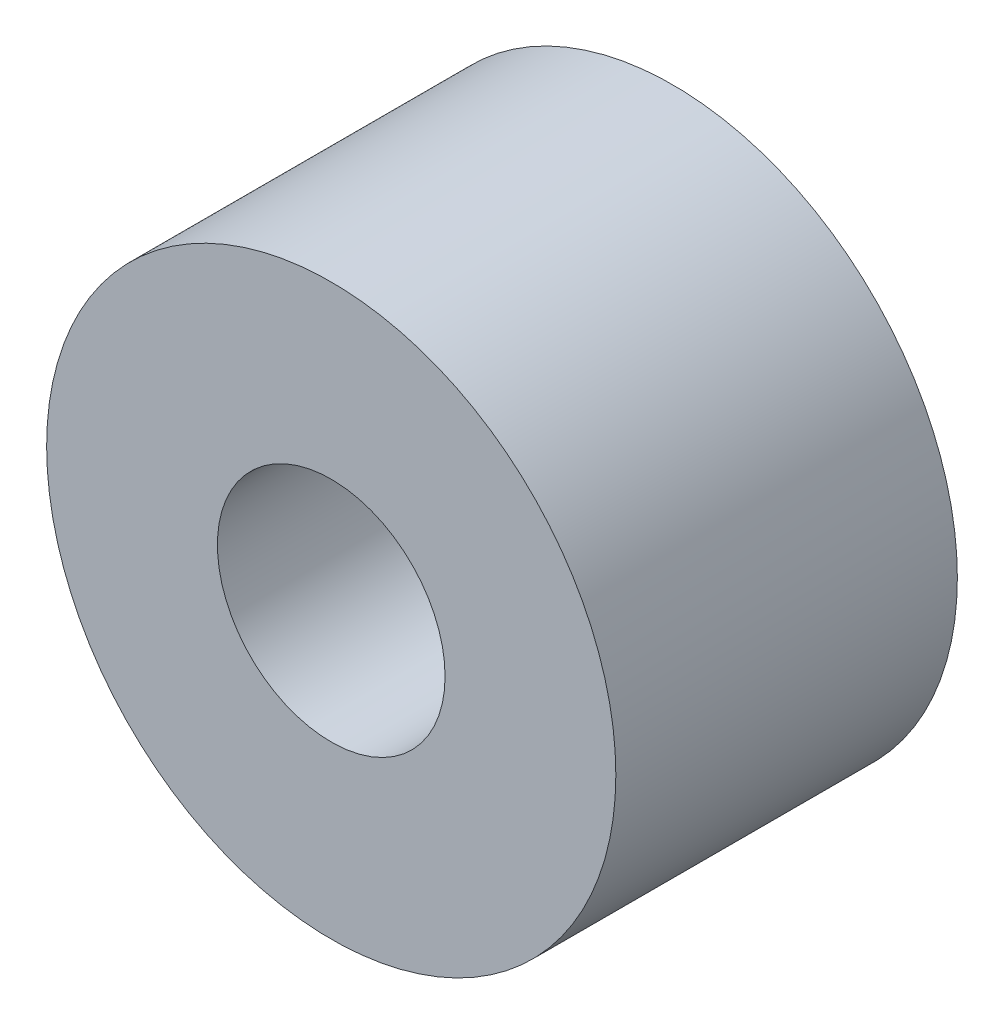
ISO-10303-21;
HEADER;
FILE_DESCRIPTION(('STEP AP214'),'2;1');
FILE_NAME('part.step','',(''),(''),'','','');
FILE_SCHEMA(('AUTOMOTIVE_DESIGN { 1 0 10303 214 1 1 1 1 }'));
ENDSEC;
DATA;
#1=APPLICATION_CONTEXT('core data for automotive mechanical design processes');
#2=APPLICATION_PROTOCOL_DEFINITION('international standard','automotive_design',2000,#1);
#3=PRODUCT_CONTEXT('',#1,'mechanical');
#4=PRODUCT('Part','Part','',(#3));
#5=PRODUCT_RELATED_PRODUCT_CATEGORY('part','',(#4));
#6=PRODUCT_DEFINITION_FORMATION('','',#4);
#7=PRODUCT_DEFINITION_CONTEXT('part definition',#1,'design');
#8=PRODUCT_DEFINITION('design','',#6,#7);
#9=PRODUCT_DEFINITION_SHAPE('','',#8);
#10=(LENGTH_UNIT() NAMED_UNIT(*) SI_UNIT(.MILLI.,.METRE.));
#11=(NAMED_UNIT(*) PLANE_ANGLE_UNIT() SI_UNIT($,.RADIAN.));
#12=(NAMED_UNIT(*) SI_UNIT($,.STERADIAN.) SOLID_ANGLE_UNIT());
#13=UNCERTAINTY_MEASURE_WITH_UNIT(LENGTH_MEASURE(1.E-05),#10,'distance_accuracy_value','');
#14=(GEOMETRIC_REPRESENTATION_CONTEXT(3) GLOBAL_UNCERTAINTY_ASSIGNED_CONTEXT((#13)) GLOBAL_UNIT_ASSIGNED_CONTEXT((#10,
#11,#12)) REPRESENTATION_CONTEXT('',''));
#15=CARTESIAN_POINT('',(0.,0.,0.));
#16=DIRECTION('',(0.,0.,1.));
#17=DIRECTION('',(1.,0.,0.));
#18=AXIS2_PLACEMENT_3D('',#15,#16,#17);
#19=CARTESIAN_POINT('',(0.,0.,6.));
#20=DIRECTION('',(0.,0.,-1.));
#21=DIRECTION('',(-1.,0.,0.));
#22=AXIS2_PLACEMENT_3D('',#19,#20,#21);
#23=CYLINDRICAL_SURFACE('',#22,5.);
#24=CARTESIAN_POINT('',(0.,0.,6.));
#25=DIRECTION('',(0.,0.,1.));
#26=DIRECTION('',(1.,0.,0.));
#27=AXIS2_PLACEMENT_3D('',#24,#25,#26);
#28=CIRCLE('',#27,5.);
#29=CARTESIAN_POINT('',(5.,0.,6.));
#30=VERTEX_POINT('',#29);
#31=EDGE_CURVE('E10',#30,#30,#28,.T.);
#32=ORIENTED_EDGE('',*,*,#31,.F.);
#33=EDGE_LOOP('',(#32));
#34=FACE_BOUND('',#33,.T.);
#35=CARTESIAN_POINT('',(0.,0.,0.));
#36=DIRECTION('',(0.,0.,1.));
#37=DIRECTION('',(1.,0.,0.));
#38=AXIS2_PLACEMENT_3D('',#35,#36,#37);
#39=CIRCLE('',#38,5.);
#40=CARTESIAN_POINT('',(5.,0.,0.));
#41=VERTEX_POINT('',#40);
#42=EDGE_CURVE('E34',#41,#41,#39,.T.);
#43=ORIENTED_EDGE('',*,*,#42,.T.);
#44=EDGE_LOOP('',(#43));
#45=FACE_BOUND('',#44,.T.);
#46=ADVANCED_FACE('F31',(#34,#45),#23,.T.);
#47=CARTESIAN_POINT('',(0.,0.,6.));
#48=DIRECTION('',(0.,0.,1.));
#49=DIRECTION('',(1.,0.,0.));
#50=AXIS2_PLACEMENT_3D('',#47,#48,#49);
#51=PLANE('',#50);
#52=CARTESIAN_POINT('',(0.,0.,6.));
#53=DIRECTION('',(0.,0.,1.));
#54=DIRECTION('',(1.,0.,0.));
#55=AXIS2_PLACEMENT_3D('',#52,#53,#54);
#56=CIRCLE('',#55,2.);
#57=CARTESIAN_POINT('',(2.,0.,6.));
#58=VERTEX_POINT('',#57);
#59=EDGE_CURVE('E43',#58,#58,#56,.T.);
#60=ORIENTED_EDGE('',*,*,#59,.F.);
#61=EDGE_LOOP('',(#60));
#62=FACE_BOUND('',#61,.T.);
#63=ORIENTED_EDGE('',*,*,#31,.T.);
#64=EDGE_LOOP('',(#63));
#65=FACE_BOUND('',#64,.T.);
#66=ADVANCED_FACE('F58',(#62,#65),#51,.T.);
#67=CARTESIAN_POINT('',(0.,0.,0.));
#68=DIRECTION('',(0.,0.,1.));
#69=DIRECTION('',(1.,0.,0.));
#70=AXIS2_PLACEMENT_3D('',#67,#68,#69);
#71=PLANE('',#70);
#72=CARTESIAN_POINT('',(0.,0.,0.));
#73=DIRECTION('',(0.,0.,1.));
#74=DIRECTION('',(1.,0.,0.));
#75=AXIS2_PLACEMENT_3D('',#72,#73,#74);
#76=CIRCLE('',#75,2.);
#77=CARTESIAN_POINT('',(2.,0.,0.));
#78=VERTEX_POINT('',#77);
#79=EDGE_CURVE('E41',#78,#78,#76,.T.);
#80=ORIENTED_EDGE('',*,*,#79,.T.);
#81=EDGE_LOOP('',(#80));
#82=FACE_BOUND('',#81,.T.);
#83=ORIENTED_EDGE('',*,*,#42,.F.);
#84=EDGE_LOOP('',(#83));
#85=FACE_BOUND('',#84,.T.);
#86=ADVANCED_FACE('F49',(#82,#85),#71,.F.);
#87=CARTESIAN_POINT('',(0.,0.,0.));
#88=DIRECTION('',(0.,0.,1.));
#89=DIRECTION('',(1.,0.,0.));
#90=AXIS2_PLACEMENT_3D('',#87,#88,#89);
#91=CYLINDRICAL_SURFACE('',#90,2.);
#92=ORIENTED_EDGE('',*,*,#79,.F.);
#93=EDGE_LOOP('',(#92));
#94=FACE_BOUND('',#93,.T.);
#95=ORIENTED_EDGE('',*,*,#59,.T.);
#96=EDGE_LOOP('',(#95));
#97=FACE_BOUND('',#96,.T.);
#98=ADVANCED_FACE('F52',(#94,#97),#91,.F.);
#99=CLOSED_SHELL('',(#46,#66,#86,#98));
#100=MANIFOLD_SOLID_BREP('B2',#99);
#101=ADVANCED_BREP_SHAPE_REPRESENTATION('',(#18,#100),#14);
#102=SHAPE_DEFINITION_REPRESENTATION(#9,#101);
ENDSEC;
END-ISO-10303-21;
